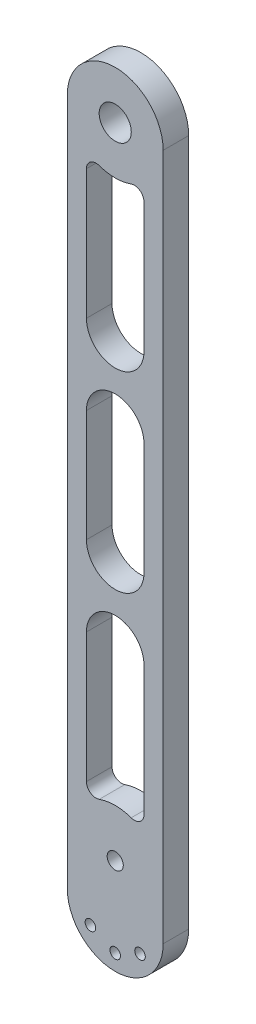
ISO-10303-21;
HEADER;
FILE_DESCRIPTION(('STEP AP214'),'2;1');
FILE_NAME('part.step','',(''),(''),'','','');
FILE_SCHEMA(('AUTOMOTIVE_DESIGN { 1 0 10303 214 1 1 1 1 }'));
ENDSEC;
DATA;
#1=APPLICATION_CONTEXT('core data for automotive mechanical design processes');
#2=APPLICATION_PROTOCOL_DEFINITION('international standard','automotive_design',2000,#1);
#3=PRODUCT_CONTEXT('',#1,'mechanical');
#4=PRODUCT('Part','Part','',(#3));
#5=PRODUCT_RELATED_PRODUCT_CATEGORY('part','',(#4));
#6=PRODUCT_DEFINITION_FORMATION('','',#4);
#7=PRODUCT_DEFINITION_CONTEXT('part definition',#1,'design');
#8=PRODUCT_DEFINITION('design','',#6,#7);
#9=PRODUCT_DEFINITION_SHAPE('','',#8);
#10=(LENGTH_UNIT() NAMED_UNIT(*) SI_UNIT(.MILLI.,.METRE.));
#11=(NAMED_UNIT(*) PLANE_ANGLE_UNIT() SI_UNIT($,.RADIAN.));
#12=(NAMED_UNIT(*) SI_UNIT($,.STERADIAN.) SOLID_ANGLE_UNIT());
#13=UNCERTAINTY_MEASURE_WITH_UNIT(LENGTH_MEASURE(1.E-05),#10,'distance_accuracy_value','');
#14=(GEOMETRIC_REPRESENTATION_CONTEXT(3) GLOBAL_UNCERTAINTY_ASSIGNED_CONTEXT((#13)) GLOBAL_UNIT_ASSIGNED_CONTEXT((#10,
#11,#12)) REPRESENTATION_CONTEXT('',''));
#15=CARTESIAN_POINT('',(0.,0.,0.));
#16=DIRECTION('',(0.,0.,1.));
#17=DIRECTION('',(1.,0.,0.));
#18=AXIS2_PLACEMENT_3D('',#15,#16,#17);
#19=CARTESIAN_POINT('',(0.,0.,8.));
#20=DIRECTION('',(0.,0.,1.));
#21=DIRECTION('',(1.,0.,0.));
#22=AXIS2_PLACEMENT_3D('',#19,#20,#21);
#23=PLANE('',#22);
#24=CARTESIAN_POINT('',(0.,0.,8.));
#25=DIRECTION('',(0.,0.,1.));
#26=DIRECTION('',(1.,0.,0.));
#27=AXIS2_PLACEMENT_3D('',#24,#25,#26);
#28=CIRCLE('',#27,5.025);
#29=CARTESIAN_POINT('',(5.025,0.,8.));
#30=VERTEX_POINT('',#29);
#31=EDGE_CURVE('E336',#30,#30,#28,.T.);
#32=ORIENTED_EDGE('',*,*,#31,.F.);
#33=EDGE_LOOP('',(#32));
#34=FACE_BOUND('',#33,.T.);
#35=CARTESIAN_POINT('',(0.,0.,8.));
#36=DIRECTION('',(0.,0.,1.));
#37=DIRECTION('',(1.,0.,0.));
#38=AXIS2_PLACEMENT_3D('',#35,#36,#37);
#39=CIRCLE('',#38,15.);
#40=CARTESIAN_POINT('',(15.,0.,8.));
#41=VERTEX_POINT('',#40);
#42=CARTESIAN_POINT('',(-15.,0.,8.));
#43=VERTEX_POINT('',#42);
#44=EDGE_CURVE('E189',#41,#43,#39,.T.);
#45=ORIENTED_EDGE('',*,*,#44,.T.);
#46=DIRECTION('',(0.,-1.,0.));
#47=VECTOR('',#46,1.);
#48=CARTESIAN_POINT('',(-15.,0.,8.));
#49=LINE('',#48,#47);
#50=CARTESIAN_POINT('',(-15.,-215.,8.));
#51=VERTEX_POINT('',#50);
#52=EDGE_CURVE('E182',#43,#51,#49,.T.);
#53=ORIENTED_EDGE('',*,*,#52,.T.);
#54=CARTESIAN_POINT('',(0.,-215.,8.));
#55=DIRECTION('',(0.,0.,1.));
#56=DIRECTION('',(1.,0.,0.));
#57=AXIS2_PLACEMENT_3D('',#54,#55,#56);
#58=CIRCLE('',#57,15.);
#59=CARTESIAN_POINT('',(15.,-215.,8.));
#60=VERTEX_POINT('',#59);
#61=EDGE_CURVE('E186',#51,#60,#58,.T.);
#62=ORIENTED_EDGE('',*,*,#61,.T.);
#63=DIRECTION('',(0.,1.,0.));
#64=VECTOR('',#63,1.);
#65=CARTESIAN_POINT('',(15.,0.,8.));
#66=LINE('',#65,#64);
#67=EDGE_CURVE('E192',#60,#41,#66,.T.);
#68=ORIENTED_EDGE('',*,*,#67,.T.);
#69=EDGE_LOOP('',(#45,#53,#62,#68));
#70=FACE_BOUND('',#69,.T.);
#71=CARTESIAN_POINT('',(0.,-200.,8.));
#72=DIRECTION('',(0.,0.,1.));
#73=DIRECTION('',(1.,0.,0.));
#74=AXIS2_PLACEMENT_3D('',#71,#72,#73);
#75=CIRCLE('',#74,2.525);
#76=CARTESIAN_POINT('',(2.525,-200.,8.));
#77=VERTEX_POINT('',#76);
#78=EDGE_CURVE('E330',#77,#77,#75,.T.);
#79=ORIENTED_EDGE('',*,*,#78,.F.);
#80=EDGE_LOOP('',(#79));
#81=FACE_BOUND('',#80,.T.);
#82=DIRECTION('',(0.,1.,0.));
#83=VECTOR('',#82,1.);
#84=CARTESIAN_POINT('',(9.,-16.9705627484771,8.));
#85=LINE('',#84,#83);
#86=CARTESIAN_POINT('',(9.,-57.5,8.));
#87=VERTEX_POINT('',#86);
#88=CARTESIAN_POINT('',(9.,-16.9705627484771,8.));
#89=VERTEX_POINT('',#88);
#90=EDGE_CURVE('E287',#87,#89,#85,.T.);
#91=ORIENTED_EDGE('',*,*,#90,.F.);
#92=CARTESIAN_POINT('',(0.,-57.5,8.));
#93=DIRECTION('',(0.,0.,1.));
#94=DIRECTION('',(1.,0.,0.));
#95=AXIS2_PLACEMENT_3D('',#92,#93,#94);
#96=CIRCLE('',#95,9.);
#97=CARTESIAN_POINT('',(-9.,-57.5,8.));
#98=VERTEX_POINT('',#97);
#99=EDGE_CURVE('E285',#98,#87,#96,.T.);
#100=ORIENTED_EDGE('',*,*,#99,.F.);
#101=DIRECTION('',(0.,-1.,0.));
#102=VECTOR('',#101,1.);
#103=CARTESIAN_POINT('',(-9.,-16.9705627484771,8.));
#104=LINE('',#103,#102);
#105=CARTESIAN_POINT('',(-9.,-16.9705627484771,8.));
#106=VERTEX_POINT('',#105);
#107=EDGE_CURVE('E297',#106,#98,#104,.T.);
#108=ORIENTED_EDGE('',*,*,#107,.F.);
#109=CARTESIAN_POINT('',(-6.,-16.9705627484771,8.));
#110=DIRECTION('',(0.,0.,1.));
#111=DIRECTION('',(1.,0.,0.));
#112=AXIS2_PLACEMENT_3D('',#109,#110,#111);
#113=CIRCLE('',#112,3.);
#114=CARTESIAN_POINT('',(-5.,-14.142135623731,8.));
#115=VERTEX_POINT('',#114);
#116=EDGE_CURVE('E294',#115,#106,#113,.T.);
#117=ORIENTED_EDGE('',*,*,#116,.F.);
#118=CARTESIAN_POINT('',(0.,0.,8.));
#119=DIRECTION('',(0.,0.,-1.));
#120=DIRECTION('',(1.,0.,0.));
#121=AXIS2_PLACEMENT_3D('',#118,#119,#120);
#122=CIRCLE('',#121,15.);
#123=CARTESIAN_POINT('',(5.,-14.142135623731,8.));
#124=VERTEX_POINT('',#123);
#125=EDGE_CURVE('E292',#124,#115,#122,.T.);
#126=ORIENTED_EDGE('',*,*,#125,.F.);
#127=CARTESIAN_POINT('',(6.,-16.9705627484771,8.));
#128=DIRECTION('',(0.,0.,1.));
#129=DIRECTION('',(1.,0.,0.));
#130=AXIS2_PLACEMENT_3D('',#127,#128,#129);
#131=CIRCLE('',#130,3.);
#132=EDGE_CURVE('E290',#89,#124,#131,.T.);
#133=ORIENTED_EDGE('',*,*,#132,.F.);
#134=EDGE_LOOP('',(#91,#100,#108,#117,#126,#133));
#135=FACE_BOUND('',#134,.T.);
#136=DIRECTION('',(0.,-1.,0.));
#137=VECTOR('',#136,1.);
#138=CARTESIAN_POINT('',(-8.99999999999999,-82.5,8.));
#139=LINE('',#138,#137);
#140=CARTESIAN_POINT('',(-8.99999999999999,-82.5,8.));
#141=VERTEX_POINT('',#140);
#142=CARTESIAN_POINT('',(-8.99999999999999,-117.5,8.));
#143=VERTEX_POINT('',#142);
#144=EDGE_CURVE('E256',#141,#143,#139,.T.);
#145=ORIENTED_EDGE('',*,*,#144,.F.);
#146=CARTESIAN_POINT('',(0.,-82.5,8.));
#147=DIRECTION('',(0.,0.,1.));
#148=DIRECTION('',(1.,0.,0.));
#149=AXIS2_PLACEMENT_3D('',#146,#147,#148);
#150=CIRCLE('',#149,9.);
#151=CARTESIAN_POINT('',(9.00000000000001,-82.5,8.));
#152=VERTEX_POINT('',#151);
#153=EDGE_CURVE('E254',#152,#141,#150,.T.);
#154=ORIENTED_EDGE('',*,*,#153,.F.);
#155=DIRECTION('',(0.,1.,0.));
#156=VECTOR('',#155,1.);
#157=CARTESIAN_POINT('',(9.00000000000001,-82.5,8.));
#158=LINE('',#157,#156);
#159=CARTESIAN_POINT('',(9.00000000000002,-117.5,8.));
#160=VERTEX_POINT('',#159);
#161=EDGE_CURVE('E262',#160,#152,#158,.T.);
#162=ORIENTED_EDGE('',*,*,#161,.F.);
#163=CARTESIAN_POINT('',(0.,-117.5,8.));
#164=DIRECTION('',(0.,0.,1.));
#165=DIRECTION('',(1.,0.,0.));
#166=AXIS2_PLACEMENT_3D('',#163,#164,#165);
#167=CIRCLE('',#166,9.);
#168=EDGE_CURVE('E259',#143,#160,#167,.T.);
#169=ORIENTED_EDGE('',*,*,#168,.F.);
#170=EDGE_LOOP('',(#145,#154,#162,#169));
#171=FACE_BOUND('',#170,.T.);
#172=CARTESIAN_POINT('',(6.,-183.029437251523,8.));
#173=DIRECTION('',(0.,0.,1.));
#174=DIRECTION('',(-1.,0.,0.));
#175=AXIS2_PLACEMENT_3D('',#172,#173,#174);
#176=CIRCLE('',#175,3.);
#177=CARTESIAN_POINT('',(5.,-185.857864376269,8.));
#178=VERTEX_POINT('',#177);
#179=CARTESIAN_POINT('',(9.,-183.029437251523,8.));
#180=VERTEX_POINT('',#179);
#181=EDGE_CURVE('E216',#178,#180,#176,.T.);
#182=ORIENTED_EDGE('',*,*,#181,.F.);
#183=CARTESIAN_POINT('',(0.,-200.,8.));
#184=DIRECTION('',(0.,0.,-1.));
#185=DIRECTION('',(-1.,0.,0.));
#186=AXIS2_PLACEMENT_3D('',#183,#184,#185);
#187=CIRCLE('',#186,15.);
#188=CARTESIAN_POINT('',(-4.99999999999999,-185.857864376269,8.));
#189=VERTEX_POINT('',#188);
#190=EDGE_CURVE('E214',#189,#178,#187,.T.);
#191=ORIENTED_EDGE('',*,*,#190,.F.);
#192=CARTESIAN_POINT('',(-6.,-183.029437251523,8.));
#193=DIRECTION('',(0.,0.,1.));
#194=DIRECTION('',(-1.,0.,0.));
#195=AXIS2_PLACEMENT_3D('',#192,#193,#194);
#196=CIRCLE('',#195,3.);
#197=CARTESIAN_POINT('',(-8.99999999999999,-183.029437251523,8.));
#198=VERTEX_POINT('',#197);
#199=EDGE_CURVE('E225',#198,#189,#196,.T.);
#200=ORIENTED_EDGE('',*,*,#199,.F.);
#201=DIRECTION('',(0.,-1.,0.));
#202=VECTOR('',#201,1.);
#203=CARTESIAN_POINT('',(-9.,-183.029437251523,8.));
#204=LINE('',#203,#202);
#205=CARTESIAN_POINT('',(-9.,-142.5,8.));
#206=VERTEX_POINT('',#205);
#207=EDGE_CURVE('E223',#206,#198,#204,.T.);
#208=ORIENTED_EDGE('',*,*,#207,.F.);
#209=CARTESIAN_POINT('',(0.,-142.5,8.));
#210=DIRECTION('',(0.,0.,1.));
#211=DIRECTION('',(-1.,0.,0.));
#212=AXIS2_PLACEMENT_3D('',#209,#210,#211);
#213=CIRCLE('',#212,9.);
#214=CARTESIAN_POINT('',(9.,-142.5,8.));
#215=VERTEX_POINT('',#214);
#216=EDGE_CURVE('E221',#215,#206,#213,.T.);
#217=ORIENTED_EDGE('',*,*,#216,.F.);
#218=DIRECTION('',(0.,1.,0.));
#219=VECTOR('',#218,1.);
#220=CARTESIAN_POINT('',(9.,-183.029437251523,8.));
#221=LINE('',#220,#219);
#222=EDGE_CURVE('E219',#180,#215,#221,.T.);
#223=ORIENTED_EDGE('',*,*,#222,.F.);
#224=EDGE_LOOP('',(#182,#191,#200,#208,#217,#223));
#225=FACE_BOUND('',#224,.T.);
#226=CARTESIAN_POINT('',(-7.75670725284747,-221.311378026519,8.));
#227=DIRECTION('',(0.,0.,1.));
#228=DIRECTION('',(1.,0.,0.));
#229=AXIS2_PLACEMENT_3D('',#226,#227,#228);
#230=CIRCLE('',#229,1.65);
#231=CARTESIAN_POINT('',(-6.10670725284746,-221.311378026519,8.));
#232=VERTEX_POINT('',#231);
#233=EDGE_CURVE('E469',#232,#232,#230,.T.);
#234=ORIENTED_EDGE('',*,*,#233,.F.);
#235=EDGE_LOOP('',(#234));
#236=FACE_BOUND('',#235,.T.);
#237=CARTESIAN_POINT('',(0.,-225.,8.));
#238=DIRECTION('',(0.,0.,1.));
#239=DIRECTION('',(1.,0.,0.));
#240=AXIS2_PLACEMENT_3D('',#237,#238,#239);
#241=CIRCLE('',#240,1.65);
#242=CARTESIAN_POINT('',(1.65000000000001,-225.,8.));
#243=VERTEX_POINT('',#242);
#244=EDGE_CURVE('E208',#243,#243,#241,.T.);
#245=ORIENTED_EDGE('',*,*,#244,.F.);
#246=EDGE_LOOP('',(#245));
#247=FACE_BOUND('',#246,.T.);
#248=CARTESIAN_POINT('',(7.75670725284747,-221.311378026519,8.));
#249=DIRECTION('',(0.,0.,1.));
#250=DIRECTION('',(1.,0.,0.));
#251=AXIS2_PLACEMENT_3D('',#248,#249,#250);
#252=CIRCLE('',#251,1.65);
#253=CARTESIAN_POINT('',(9.40670725284747,-221.311378026519,8.));
#254=VERTEX_POINT('',#253);
#255=EDGE_CURVE('E460',#254,#254,#252,.T.);
#256=ORIENTED_EDGE('',*,*,#255,.F.);
#257=EDGE_LOOP('',(#256));
#258=FACE_BOUND('',#257,.T.);
#259=ADVANCED_FACE('F43',(#34,#70,#81,#135,#171,#225,#236,#247,#258),#23,.T.);
#260=CARTESIAN_POINT('',(0.,0.,0.));
#261=DIRECTION('',(0.,0.,1.));
#262=DIRECTION('',(1.,0.,0.));
#263=AXIS2_PLACEMENT_3D('',#260,#261,#262);
#264=PLANE('',#263);
#265=CARTESIAN_POINT('',(0.,-82.5,0.));
#266=DIRECTION('',(0.,0.,1.));
#267=DIRECTION('',(1.,0.,0.));
#268=AXIS2_PLACEMENT_3D('',#265,#266,#267);
#269=CIRCLE('',#268,9.);
#270=CARTESIAN_POINT('',(9.00000000000001,-82.5,0.));
#271=VERTEX_POINT('',#270);
#272=CARTESIAN_POINT('',(-8.99999999999999,-82.5,0.));
#273=VERTEX_POINT('',#272);
#274=EDGE_CURVE('E253',#271,#273,#269,.T.);
#275=ORIENTED_EDGE('',*,*,#274,.T.);
#276=DIRECTION('',(0.,-1.,0.));
#277=VECTOR('',#276,1.);
#278=CARTESIAN_POINT('',(-8.99999999999999,-82.5,0.));
#279=LINE('',#278,#277);
#280=CARTESIAN_POINT('',(-8.99999999999999,-117.5,0.));
#281=VERTEX_POINT('',#280);
#282=EDGE_CURVE('E267',#273,#281,#279,.T.);
#283=ORIENTED_EDGE('',*,*,#282,.T.);
#284=CARTESIAN_POINT('',(0.,-117.5,0.));
#285=DIRECTION('',(0.,0.,1.));
#286=DIRECTION('',(1.,0.,0.));
#287=AXIS2_PLACEMENT_3D('',#284,#285,#286);
#288=CIRCLE('',#287,9.);
#289=CARTESIAN_POINT('',(9.00000000000002,-117.5,0.));
#290=VERTEX_POINT('',#289);
#291=EDGE_CURVE('E270',#281,#290,#288,.T.);
#292=ORIENTED_EDGE('',*,*,#291,.T.);
#293=DIRECTION('',(0.,1.,0.));
#294=VECTOR('',#293,1.);
#295=CARTESIAN_POINT('',(9.00000000000001,-82.5,0.));
#296=LINE('',#295,#294);
#297=EDGE_CURVE('E257',#290,#271,#296,.T.);
#298=ORIENTED_EDGE('',*,*,#297,.T.);
#299=EDGE_LOOP('',(#275,#283,#292,#298));
#300=FACE_BOUND('',#299,.T.);
#301=CARTESIAN_POINT('',(0.,-200.,0.));
#302=DIRECTION('',(0.,0.,1.));
#303=DIRECTION('',(1.,0.,0.));
#304=AXIS2_PLACEMENT_3D('',#301,#302,#303);
#305=CIRCLE('',#304,2.525);
#306=CARTESIAN_POINT('',(2.525,-200.,0.));
#307=VERTEX_POINT('',#306);
#308=EDGE_CURVE('E329',#307,#307,#305,.T.);
#309=ORIENTED_EDGE('',*,*,#308,.T.);
#310=EDGE_LOOP('',(#309));
#311=FACE_BOUND('',#310,.T.);
#312=CARTESIAN_POINT('',(0.,0.,0.));
#313=DIRECTION('',(0.,0.,1.));
#314=DIRECTION('',(1.,0.,0.));
#315=AXIS2_PLACEMENT_3D('',#312,#313,#314);
#316=CIRCLE('',#315,5.025);
#317=CARTESIAN_POINT('',(5.025,0.,0.));
#318=VERTEX_POINT('',#317);
#319=EDGE_CURVE('E333',#318,#318,#316,.T.);
#320=ORIENTED_EDGE('',*,*,#319,.T.);
#321=EDGE_LOOP('',(#320));
#322=FACE_BOUND('',#321,.T.);
#323=CARTESIAN_POINT('',(0.,0.,0.));
#324=DIRECTION('',(0.,0.,1.));
#325=DIRECTION('',(1.,0.,0.));
#326=AXIS2_PLACEMENT_3D('',#323,#324,#325);
#327=CIRCLE('',#326,15.);
#328=CARTESIAN_POINT('',(15.,0.,0.));
#329=VERTEX_POINT('',#328);
#330=CARTESIAN_POINT('',(-15.,0.,0.));
#331=VERTEX_POINT('',#330);
#332=EDGE_CURVE('E339',#329,#331,#327,.T.);
#333=ORIENTED_EDGE('',*,*,#332,.F.);
#334=DIRECTION('',(0.,1.,0.));
#335=VECTOR('',#334,1.);
#336=CARTESIAN_POINT('',(15.,0.,0.));
#337=LINE('',#336,#335);
#338=CARTESIAN_POINT('',(15.,-215.,0.));
#339=VERTEX_POINT('',#338);
#340=EDGE_CURVE('E342',#339,#329,#337,.T.);
#341=ORIENTED_EDGE('',*,*,#340,.F.);
#342=CARTESIAN_POINT('',(0.,-215.,0.));
#343=DIRECTION('',(0.,0.,1.));
#344=DIRECTION('',(1.,0.,0.));
#345=AXIS2_PLACEMENT_3D('',#342,#343,#344);
#346=CIRCLE('',#345,15.);
#347=CARTESIAN_POINT('',(-15.,-215.,0.));
#348=VERTEX_POINT('',#347);
#349=EDGE_CURVE('E205',#348,#339,#346,.T.);
#350=ORIENTED_EDGE('',*,*,#349,.F.);
#351=DIRECTION('',(0.,-1.,0.));
#352=VECTOR('',#351,1.);
#353=CARTESIAN_POINT('',(-15.,0.,0.));
#354=LINE('',#353,#352);
#355=EDGE_CURVE('E197',#331,#348,#354,.T.);
#356=ORIENTED_EDGE('',*,*,#355,.F.);
#357=EDGE_LOOP('',(#333,#341,#350,#356));
#358=FACE_BOUND('',#357,.T.);
#359=CARTESIAN_POINT('',(0.,-57.5,0.));
#360=DIRECTION('',(0.,0.,1.));
#361=DIRECTION('',(1.,0.,0.));
#362=AXIS2_PLACEMENT_3D('',#359,#360,#361);
#363=CIRCLE('',#362,9.);
#364=CARTESIAN_POINT('',(-9.,-57.5,0.));
#365=VERTEX_POINT('',#364);
#366=CARTESIAN_POINT('',(9.,-57.5,0.));
#367=VERTEX_POINT('',#366);
#368=EDGE_CURVE('E284',#365,#367,#363,.T.);
#369=ORIENTED_EDGE('',*,*,#368,.T.);
#370=DIRECTION('',(0.,1.,0.));
#371=VECTOR('',#370,1.);
#372=CARTESIAN_POINT('',(9.,-16.9705627484771,0.));
#373=LINE('',#372,#371);
#374=CARTESIAN_POINT('',(9.,-16.9705627484771,0.));
#375=VERTEX_POINT('',#374);
#376=EDGE_CURVE('E302',#367,#375,#373,.T.);
#377=ORIENTED_EDGE('',*,*,#376,.T.);
#378=CARTESIAN_POINT('',(6.,-16.9705627484771,0.));
#379=DIRECTION('',(0.,0.,1.));
#380=DIRECTION('',(1.,0.,0.));
#381=AXIS2_PLACEMENT_3D('',#378,#379,#380);
#382=CIRCLE('',#381,3.);
#383=CARTESIAN_POINT('',(5.,-14.142135623731,0.));
#384=VERTEX_POINT('',#383);
#385=EDGE_CURVE('E305',#375,#384,#382,.T.);
#386=ORIENTED_EDGE('',*,*,#385,.T.);
#387=CARTESIAN_POINT('',(0.,0.,0.));
#388=DIRECTION('',(0.,0.,-1.));
#389=DIRECTION('',(1.,0.,0.));
#390=AXIS2_PLACEMENT_3D('',#387,#388,#389);
#391=CIRCLE('',#390,15.);
#392=CARTESIAN_POINT('',(-5.,-14.142135623731,0.));
#393=VERTEX_POINT('',#392);
#394=EDGE_CURVE('E308',#384,#393,#391,.T.);
#395=ORIENTED_EDGE('',*,*,#394,.T.);
#396=CARTESIAN_POINT('',(-6.,-16.9705627484771,0.));
#397=DIRECTION('',(0.,0.,1.));
#398=DIRECTION('',(1.,0.,0.));
#399=AXIS2_PLACEMENT_3D('',#396,#397,#398);
#400=CIRCLE('',#399,3.);
#401=CARTESIAN_POINT('',(-9.,-16.9705627484771,0.));
#402=VERTEX_POINT('',#401);
#403=EDGE_CURVE('E311',#393,#402,#400,.T.);
#404=ORIENTED_EDGE('',*,*,#403,.T.);
#405=DIRECTION('',(0.,-1.,0.));
#406=VECTOR('',#405,1.);
#407=CARTESIAN_POINT('',(-9.,-16.9705627484771,0.));
#408=LINE('',#407,#406);
#409=EDGE_CURVE('E288',#402,#365,#408,.T.);
#410=ORIENTED_EDGE('',*,*,#409,.T.);
#411=EDGE_LOOP('',(#369,#377,#386,#395,#404,#410));
#412=FACE_BOUND('',#411,.T.);
#413=CARTESIAN_POINT('',(0.,-200.,0.));
#414=DIRECTION('',(0.,0.,-1.));
#415=DIRECTION('',(-1.,0.,0.));
#416=AXIS2_PLACEMENT_3D('',#413,#414,#415);
#417=CIRCLE('',#416,15.);
#418=CARTESIAN_POINT('',(-4.99999999999999,-185.857864376269,0.));
#419=VERTEX_POINT('',#418);
#420=CARTESIAN_POINT('',(5.,-185.857864376269,0.));
#421=VERTEX_POINT('',#420);
#422=EDGE_CURVE('E66',#419,#421,#417,.T.);
#423=ORIENTED_EDGE('',*,*,#422,.T.);
#424=CARTESIAN_POINT('',(6.,-183.029437251523,0.));
#425=DIRECTION('',(0.,0.,1.));
#426=DIRECTION('',(-1.,0.,0.));
#427=AXIS2_PLACEMENT_3D('',#424,#425,#426);
#428=CIRCLE('',#427,3.);
#429=CARTESIAN_POINT('',(9.,-183.029437251523,0.));
#430=VERTEX_POINT('',#429);
#431=EDGE_CURVE('E229',#421,#430,#428,.T.);
#432=ORIENTED_EDGE('',*,*,#431,.T.);
#433=DIRECTION('',(0.,1.,0.));
#434=VECTOR('',#433,1.);
#435=CARTESIAN_POINT('',(9.,-183.029437251523,0.));
#436=LINE('',#435,#434);
#437=CARTESIAN_POINT('',(9.,-142.5,0.));
#438=VERTEX_POINT('',#437);
#439=EDGE_CURVE('E232',#430,#438,#436,.T.);
#440=ORIENTED_EDGE('',*,*,#439,.T.);
#441=CARTESIAN_POINT('',(0.,-142.5,0.));
#442=DIRECTION('',(0.,0.,1.));
#443=DIRECTION('',(-1.,0.,0.));
#444=AXIS2_PLACEMENT_3D('',#441,#442,#443);
#445=CIRCLE('',#444,9.);
#446=CARTESIAN_POINT('',(-9.,-142.5,0.));
#447=VERTEX_POINT('',#446);
#448=EDGE_CURVE('E235',#438,#447,#445,.T.);
#449=ORIENTED_EDGE('',*,*,#448,.T.);
#450=DIRECTION('',(0.,-1.,0.));
#451=VECTOR('',#450,1.);
#452=CARTESIAN_POINT('',(-9.,-183.029437251523,0.));
#453=LINE('',#452,#451);
#454=CARTESIAN_POINT('',(-8.99999999999999,-183.029437251523,0.));
#455=VERTEX_POINT('',#454);
#456=EDGE_CURVE('E238',#447,#455,#453,.T.);
#457=ORIENTED_EDGE('',*,*,#456,.T.);
#458=CARTESIAN_POINT('',(-6.,-183.029437251523,0.));
#459=DIRECTION('',(0.,0.,1.));
#460=DIRECTION('',(-1.,0.,0.));
#461=AXIS2_PLACEMENT_3D('',#458,#459,#460);
#462=CIRCLE('',#461,3.);
#463=EDGE_CURVE('E217',#455,#419,#462,.T.);
#464=ORIENTED_EDGE('',*,*,#463,.T.);
#465=EDGE_LOOP('',(#423,#432,#440,#449,#457,#464));
#466=FACE_BOUND('',#465,.T.);
#467=CARTESIAN_POINT('',(0.,-225.,0.));
#468=DIRECTION('',(0.,0.,1.));
#469=DIRECTION('',(1.,0.,0.));
#470=AXIS2_PLACEMENT_3D('',#467,#468,#469);
#471=CIRCLE('',#470,1.65);
#472=CARTESIAN_POINT('',(1.65000000000001,-225.,0.));
#473=VERTEX_POINT('',#472);
#474=EDGE_CURVE('E211',#473,#473,#471,.T.);
#475=ORIENTED_EDGE('',*,*,#474,.T.);
#476=EDGE_LOOP('',(#475));
#477=FACE_BOUND('',#476,.T.);
#478=CARTESIAN_POINT('',(-7.75670725284747,-221.311378026519,0.));
#479=DIRECTION('',(0.,0.,1.));
#480=DIRECTION('',(1.,0.,0.));
#481=AXIS2_PLACEMENT_3D('',#478,#479,#480);
#482=CIRCLE('',#481,1.65);
#483=CARTESIAN_POINT('',(-6.10670725284746,-221.311378026519,0.));
#484=VERTEX_POINT('',#483);
#485=EDGE_CURVE('E466',#484,#484,#482,.T.);
#486=ORIENTED_EDGE('',*,*,#485,.T.);
#487=EDGE_LOOP('',(#486));
#488=FACE_BOUND('',#487,.T.);
#489=CARTESIAN_POINT('',(7.75670725284747,-221.311378026519,0.));
#490=DIRECTION('',(0.,0.,1.));
#491=DIRECTION('',(1.,0.,0.));
#492=AXIS2_PLACEMENT_3D('',#489,#490,#491);
#493=CIRCLE('',#492,1.65);
#494=CARTESIAN_POINT('',(9.40670725284747,-221.311378026519,0.));
#495=VERTEX_POINT('',#494);
#496=EDGE_CURVE('E463',#495,#495,#493,.T.);
#497=ORIENTED_EDGE('',*,*,#496,.T.);
#498=EDGE_LOOP('',(#497));
#499=FACE_BOUND('',#498,.T.);
#500=ADVANCED_FACE('F354',(#300,#311,#322,#358,#412,#466,#477,#488,#499),#264,.F.);
#501=CARTESIAN_POINT('',(0.,0.,8.));
#502=DIRECTION('',(0.,0.,-1.));
#503=DIRECTION('',(-1.,0.,0.));
#504=AXIS2_PLACEMENT_3D('',#501,#502,#503);
#505=CYLINDRICAL_SURFACE('',#504,15.);
#506=ORIENTED_EDGE('',*,*,#332,.T.);
#507=DIRECTION('',(0.,0.,-1.));
#508=VECTOR('',#507,1.);
#509=CARTESIAN_POINT('',(-15.,0.,8.));
#510=LINE('',#509,#508);
#511=EDGE_CURVE('E11',#43,#331,#510,.T.);
#512=ORIENTED_EDGE('',*,*,#511,.F.);
#513=ORIENTED_EDGE('',*,*,#44,.F.);
#514=DIRECTION('',(0.,0.,-1.));
#515=VECTOR('',#514,1.);
#516=CARTESIAN_POINT('',(15.,0.,8.));
#517=LINE('',#516,#515);
#518=EDGE_CURVE('E51',#41,#329,#517,.T.);
#519=ORIENTED_EDGE('',*,*,#518,.T.);
#520=EDGE_LOOP('',(#506,#512,#513,#519));
#521=FACE_BOUND('',#520,.T.);
#522=ADVANCED_FACE('F45',(#521),#505,.T.);
#523=CARTESIAN_POINT('',(-15.,0.,8.));
#524=DIRECTION('',(1.,0.,0.));
#525=DIRECTION('',(0.,1.,0.));
#526=AXIS2_PLACEMENT_3D('',#523,#524,#525);
#527=PLANE('',#526);
#528=ORIENTED_EDGE('',*,*,#355,.T.);
#529=DIRECTION('',(0.,0.,-1.));
#530=VECTOR('',#529,1.);
#531=CARTESIAN_POINT('',(-15.,-215.,8.));
#532=LINE('',#531,#530);
#533=EDGE_CURVE('E195',#51,#348,#532,.T.);
#534=ORIENTED_EDGE('',*,*,#533,.F.);
#535=ORIENTED_EDGE('',*,*,#52,.F.);
#536=ORIENTED_EDGE('',*,*,#511,.T.);
#537=EDGE_LOOP('',(#528,#534,#535,#536));
#538=FACE_BOUND('',#537,.T.);
#539=ADVANCED_FACE('F196',(#538),#527,.F.);
#540=CARTESIAN_POINT('',(15.,0.,8.));
#541=DIRECTION('',(-1.,0.,0.));
#542=DIRECTION('',(0.,-1.,0.));
#543=AXIS2_PLACEMENT_3D('',#540,#541,#542);
#544=PLANE('',#543);
#545=ORIENTED_EDGE('',*,*,#340,.T.);
#546=ORIENTED_EDGE('',*,*,#518,.F.);
#547=ORIENTED_EDGE('',*,*,#67,.F.);
#548=DIRECTION('',(0.,0.,-1.));
#549=VECTOR('',#548,1.);
#550=CARTESIAN_POINT('',(15.,-215.,8.));
#551=LINE('',#550,#549);
#552=EDGE_CURVE('E201',#60,#339,#551,.T.);
#553=ORIENTED_EDGE('',*,*,#552,.T.);
#554=EDGE_LOOP('',(#545,#546,#547,#553));
#555=FACE_BOUND('',#554,.T.);
#556=ADVANCED_FACE('F356',(#555),#544,.F.);
#557=CARTESIAN_POINT('',(0.,0.,8.));
#558=DIRECTION('',(0.,0.,-1.));
#559=DIRECTION('',(-1.,0.,0.));
#560=AXIS2_PLACEMENT_3D('',#557,#558,#559);
#561=CYLINDRICAL_SURFACE('',#560,5.025);
#562=ORIENTED_EDGE('',*,*,#31,.T.);
#563=EDGE_LOOP('',(#562));
#564=FACE_BOUND('',#563,.T.);
#565=ORIENTED_EDGE('',*,*,#319,.F.);
#566=EDGE_LOOP('',(#565));
#567=FACE_BOUND('',#566,.T.);
#568=ADVANCED_FACE('F358',(#564,#567),#561,.F.);
#569=CARTESIAN_POINT('',(0.,-200.,8.));
#570=DIRECTION('',(0.,0.,-1.));
#571=DIRECTION('',(-1.,0.,0.));
#572=AXIS2_PLACEMENT_3D('',#569,#570,#571);
#573=CYLINDRICAL_SURFACE('',#572,2.525);
#574=ORIENTED_EDGE('',*,*,#78,.T.);
#575=EDGE_LOOP('',(#574));
#576=FACE_BOUND('',#575,.T.);
#577=ORIENTED_EDGE('',*,*,#308,.F.);
#578=EDGE_LOOP('',(#577));
#579=FACE_BOUND('',#578,.T.);
#580=ADVANCED_FACE('F365',(#576,#579),#573,.F.);
#581=CARTESIAN_POINT('',(0.,-57.5,8.));
#582=DIRECTION('',(0.,0.,-1.));
#583=DIRECTION('',(-1.,0.,0.));
#584=AXIS2_PLACEMENT_3D('',#581,#582,#583);
#585=CYLINDRICAL_SURFACE('',#584,9.);
#586=ORIENTED_EDGE('',*,*,#368,.F.);
#587=DIRECTION('',(0.,0.,-1.));
#588=VECTOR('',#587,1.);
#589=CARTESIAN_POINT('',(-9.,-57.5,8.));
#590=LINE('',#589,#588);
#591=EDGE_CURVE('E299',#98,#365,#590,.T.);
#592=ORIENTED_EDGE('',*,*,#591,.F.);
#593=ORIENTED_EDGE('',*,*,#99,.T.);
#594=DIRECTION('',(0.,0.,-1.));
#595=VECTOR('',#594,1.);
#596=CARTESIAN_POINT('',(9.,-57.5,8.));
#597=LINE('',#596,#595);
#598=EDGE_CURVE('E326',#87,#367,#597,.T.);
#599=ORIENTED_EDGE('',*,*,#598,.T.);
#600=EDGE_LOOP('',(#586,#592,#593,#599));
#601=FACE_BOUND('',#600,.T.);
#602=ADVANCED_FACE('F381',(#601),#585,.F.);
#603=CARTESIAN_POINT('',(9.,-16.9705627484771,8.));
#604=DIRECTION('',(-1.,0.,0.));
#605=DIRECTION('',(0.,-1.,0.));
#606=AXIS2_PLACEMENT_3D('',#603,#604,#605);
#607=PLANE('',#606);
#608=ORIENTED_EDGE('',*,*,#376,.F.);
#609=ORIENTED_EDGE('',*,*,#598,.F.);
#610=ORIENTED_EDGE('',*,*,#90,.T.);
#611=DIRECTION('',(0.,0.,-1.));
#612=VECTOR('',#611,1.);
#613=CARTESIAN_POINT('',(9.,-16.9705627484771,8.));
#614=LINE('',#613,#612);
#615=EDGE_CURVE('E324',#89,#375,#614,.T.);
#616=ORIENTED_EDGE('',*,*,#615,.T.);
#617=EDGE_LOOP('',(#608,#609,#610,#616));
#618=FACE_BOUND('',#617,.T.);
#619=ADVANCED_FACE('F385',(#618),#607,.T.);
#620=CARTESIAN_POINT('',(6.,-16.9705627484771,8.));
#621=DIRECTION('',(0.,0.,-1.));
#622=DIRECTION('',(-1.,0.,0.));
#623=AXIS2_PLACEMENT_3D('',#620,#621,#622);
#624=CYLINDRICAL_SURFACE('',#623,3.);
#625=ORIENTED_EDGE('',*,*,#385,.F.);
#626=ORIENTED_EDGE('',*,*,#615,.F.);
#627=ORIENTED_EDGE('',*,*,#132,.T.);
#628=DIRECTION('',(0.,0.,-1.));
#629=VECTOR('',#628,1.);
#630=CARTESIAN_POINT('',(5.,-14.142135623731,8.));
#631=LINE('',#630,#629);
#632=EDGE_CURVE('E322',#124,#384,#631,.T.);
#633=ORIENTED_EDGE('',*,*,#632,.T.);
#634=EDGE_LOOP('',(#625,#626,#627,#633));
#635=FACE_BOUND('',#634,.T.);
#636=ADVANCED_FACE('F389',(#635),#624,.F.);
#637=CARTESIAN_POINT('',(0.,0.,8.));
#638=DIRECTION('',(0.,0.,-1.));
#639=DIRECTION('',(-1.,0.,0.));
#640=AXIS2_PLACEMENT_3D('',#637,#638,#639);
#641=CYLINDRICAL_SURFACE('',#640,15.);
#642=ORIENTED_EDGE('',*,*,#394,.F.);
#643=ORIENTED_EDGE('',*,*,#632,.F.);
#644=ORIENTED_EDGE('',*,*,#125,.T.);
#645=DIRECTION('',(0.,0.,-1.));
#646=VECTOR('',#645,1.);
#647=CARTESIAN_POINT('',(-5.,-14.142135623731,8.));
#648=LINE('',#647,#646);
#649=EDGE_CURVE('E320',#115,#393,#648,.T.);
#650=ORIENTED_EDGE('',*,*,#649,.T.);
#651=EDGE_LOOP('',(#642,#643,#644,#650));
#652=FACE_BOUND('',#651,.T.);
#653=ADVANCED_FACE('F393',(#652),#641,.T.);
#654=CARTESIAN_POINT('',(-6.,-16.9705627484771,8.));
#655=DIRECTION('',(0.,0.,-1.));
#656=DIRECTION('',(-1.,0.,0.));
#657=AXIS2_PLACEMENT_3D('',#654,#655,#656);
#658=CYLINDRICAL_SURFACE('',#657,3.);
#659=ORIENTED_EDGE('',*,*,#403,.F.);
#660=ORIENTED_EDGE('',*,*,#649,.F.);
#661=ORIENTED_EDGE('',*,*,#116,.T.);
#662=DIRECTION('',(0.,0.,-1.));
#663=VECTOR('',#662,1.);
#664=CARTESIAN_POINT('',(-9.,-16.9705627484771,8.));
#665=LINE('',#664,#663);
#666=EDGE_CURVE('E318',#106,#402,#665,.T.);
#667=ORIENTED_EDGE('',*,*,#666,.T.);
#668=EDGE_LOOP('',(#659,#660,#661,#667));
#669=FACE_BOUND('',#668,.T.);
#670=ADVANCED_FACE('F397',(#669),#658,.F.);
#671=CARTESIAN_POINT('',(-9.,-16.9705627484771,8.));
#672=DIRECTION('',(1.,0.,0.));
#673=DIRECTION('',(0.,1.,0.));
#674=AXIS2_PLACEMENT_3D('',#671,#672,#673);
#675=PLANE('',#674);
#676=ORIENTED_EDGE('',*,*,#409,.F.);
#677=ORIENTED_EDGE('',*,*,#666,.F.);
#678=ORIENTED_EDGE('',*,*,#107,.T.);
#679=ORIENTED_EDGE('',*,*,#591,.T.);
#680=EDGE_LOOP('',(#676,#677,#678,#679));
#681=FACE_BOUND('',#680,.T.);
#682=ADVANCED_FACE('F401',(#681),#675,.T.);
#683=CARTESIAN_POINT('',(0.,-82.5,8.));
#684=DIRECTION('',(0.,0.,-1.));
#685=DIRECTION('',(-1.,0.,0.));
#686=AXIS2_PLACEMENT_3D('',#683,#684,#685);
#687=CYLINDRICAL_SURFACE('',#686,9.);
#688=ORIENTED_EDGE('',*,*,#274,.F.);
#689=DIRECTION('',(0.,0.,-1.));
#690=VECTOR('',#689,1.);
#691=CARTESIAN_POINT('',(9.00000000000001,-82.5,8.));
#692=LINE('',#691,#690);
#693=EDGE_CURVE('E264',#152,#271,#692,.T.);
#694=ORIENTED_EDGE('',*,*,#693,.F.);
#695=ORIENTED_EDGE('',*,*,#153,.T.);
#696=DIRECTION('',(0.,0.,-1.));
#697=VECTOR('',#696,1.);
#698=CARTESIAN_POINT('',(-8.99999999999999,-82.5,8.));
#699=LINE('',#698,#697);
#700=EDGE_CURVE('E281',#141,#273,#699,.T.);
#701=ORIENTED_EDGE('',*,*,#700,.T.);
#702=EDGE_LOOP('',(#688,#694,#695,#701));
#703=FACE_BOUND('',#702,.T.);
#704=ADVANCED_FACE('F405',(#703),#687,.F.);
#705=CARTESIAN_POINT('',(-8.99999999999999,-82.5,8.));
#706=DIRECTION('',(1.,0.,0.));
#707=DIRECTION('',(0.,1.,0.));
#708=AXIS2_PLACEMENT_3D('',#705,#706,#707);
#709=PLANE('',#708);
#710=ORIENTED_EDGE('',*,*,#282,.F.);
#711=ORIENTED_EDGE('',*,*,#700,.F.);
#712=ORIENTED_EDGE('',*,*,#144,.T.);
#713=DIRECTION('',(0.,0.,-1.));
#714=VECTOR('',#713,1.);
#715=CARTESIAN_POINT('',(-8.99999999999999,-117.5,8.));
#716=LINE('',#715,#714);
#717=EDGE_CURVE('E279',#143,#281,#716,.T.);
#718=ORIENTED_EDGE('',*,*,#717,.T.);
#719=EDGE_LOOP('',(#710,#711,#712,#718));
#720=FACE_BOUND('',#719,.T.);
#721=ADVANCED_FACE('F409',(#720),#709,.T.);
#722=CARTESIAN_POINT('',(0.,-117.5,8.));
#723=DIRECTION('',(0.,0.,-1.));
#724=DIRECTION('',(-1.,0.,0.));
#725=AXIS2_PLACEMENT_3D('',#722,#723,#724);
#726=CYLINDRICAL_SURFACE('',#725,9.);
#727=ORIENTED_EDGE('',*,*,#291,.F.);
#728=ORIENTED_EDGE('',*,*,#717,.F.);
#729=ORIENTED_EDGE('',*,*,#168,.T.);
#730=DIRECTION('',(0.,0.,-1.));
#731=VECTOR('',#730,1.);
#732=CARTESIAN_POINT('',(9.00000000000002,-117.5,8.));
#733=LINE('',#732,#731);
#734=EDGE_CURVE('E277',#160,#290,#733,.T.);
#735=ORIENTED_EDGE('',*,*,#734,.T.);
#736=EDGE_LOOP('',(#727,#728,#729,#735));
#737=FACE_BOUND('',#736,.T.);
#738=ADVANCED_FACE('F413',(#737),#726,.F.);
#739=CARTESIAN_POINT('',(9.00000000000001,-82.5,8.));
#740=DIRECTION('',(-1.,0.,0.));
#741=DIRECTION('',(0.,-1.,0.));
#742=AXIS2_PLACEMENT_3D('',#739,#740,#741);
#743=PLANE('',#742);
#744=ORIENTED_EDGE('',*,*,#297,.F.);
#745=ORIENTED_EDGE('',*,*,#734,.F.);
#746=ORIENTED_EDGE('',*,*,#161,.T.);
#747=ORIENTED_EDGE('',*,*,#693,.T.);
#748=EDGE_LOOP('',(#744,#745,#746,#747));
#749=FACE_BOUND('',#748,.T.);
#750=ADVANCED_FACE('F417',(#749),#743,.T.);
#751=CARTESIAN_POINT('',(0.,-200.,8.));
#752=DIRECTION('',(0.,0.,-1.));
#753=DIRECTION('',(-1.,0.,0.));
#754=AXIS2_PLACEMENT_3D('',#751,#752,#753);
#755=CYLINDRICAL_SURFACE('',#754,15.);
#756=ORIENTED_EDGE('',*,*,#422,.F.);
#757=DIRECTION('',(0.,0.,-1.));
#758=VECTOR('',#757,1.);
#759=CARTESIAN_POINT('',(-4.99999999999999,-185.857864376269,8.));
#760=LINE('',#759,#758);
#761=EDGE_CURVE('E227',#189,#419,#760,.T.);
#762=ORIENTED_EDGE('',*,*,#761,.F.);
#763=ORIENTED_EDGE('',*,*,#190,.T.);
#764=DIRECTION('',(0.,0.,-1.));
#765=VECTOR('',#764,1.);
#766=CARTESIAN_POINT('',(5.,-185.857864376269,8.));
#767=LINE('',#766,#765);
#768=EDGE_CURVE('E251',#178,#421,#767,.T.);
#769=ORIENTED_EDGE('',*,*,#768,.T.);
#770=EDGE_LOOP('',(#756,#762,#763,#769));
#771=FACE_BOUND('',#770,.T.);
#772=ADVANCED_FACE('F421',(#771),#755,.T.);
#773=CARTESIAN_POINT('',(6.,-183.029437251523,8.));
#774=DIRECTION('',(0.,0.,-1.));
#775=DIRECTION('',(-1.,0.,0.));
#776=AXIS2_PLACEMENT_3D('',#773,#774,#775);
#777=CYLINDRICAL_SURFACE('',#776,3.);
#778=ORIENTED_EDGE('',*,*,#431,.F.);
#779=ORIENTED_EDGE('',*,*,#768,.F.);
#780=ORIENTED_EDGE('',*,*,#181,.T.);
#781=DIRECTION('',(0.,0.,-1.));
#782=VECTOR('',#781,1.);
#783=CARTESIAN_POINT('',(9.,-183.029437251523,8.));
#784=LINE('',#783,#782);
#785=EDGE_CURVE('E249',#180,#430,#784,.T.);
#786=ORIENTED_EDGE('',*,*,#785,.T.);
#787=EDGE_LOOP('',(#778,#779,#780,#786));
#788=FACE_BOUND('',#787,.T.);
#789=ADVANCED_FACE('F425',(#788),#777,.F.);
#790=CARTESIAN_POINT('',(9.,-183.029437251523,8.));
#791=DIRECTION('',(-1.,0.,0.));
#792=DIRECTION('',(0.,-1.,0.));
#793=AXIS2_PLACEMENT_3D('',#790,#791,#792);
#794=PLANE('',#793);
#795=ORIENTED_EDGE('',*,*,#439,.F.);
#796=ORIENTED_EDGE('',*,*,#785,.F.);
#797=ORIENTED_EDGE('',*,*,#222,.T.);
#798=DIRECTION('',(0.,0.,-1.));
#799=VECTOR('',#798,1.);
#800=CARTESIAN_POINT('',(9.,-142.5,8.));
#801=LINE('',#800,#799);
#802=EDGE_CURVE('E247',#215,#438,#801,.T.);
#803=ORIENTED_EDGE('',*,*,#802,.T.);
#804=EDGE_LOOP('',(#795,#796,#797,#803));
#805=FACE_BOUND('',#804,.T.);
#806=ADVANCED_FACE('F428',(#805),#794,.T.);
#807=CARTESIAN_POINT('',(0.,-142.5,8.));
#808=DIRECTION('',(0.,0.,-1.));
#809=DIRECTION('',(-1.,0.,0.));
#810=AXIS2_PLACEMENT_3D('',#807,#808,#809);
#811=CYLINDRICAL_SURFACE('',#810,9.);
#812=ORIENTED_EDGE('',*,*,#448,.F.);
#813=ORIENTED_EDGE('',*,*,#802,.F.);
#814=ORIENTED_EDGE('',*,*,#216,.T.);
#815=DIRECTION('',(0.,0.,-1.));
#816=VECTOR('',#815,1.);
#817=CARTESIAN_POINT('',(-9.,-142.5,8.));
#818=LINE('',#817,#816);
#819=EDGE_CURVE('E245',#206,#447,#818,.T.);
#820=ORIENTED_EDGE('',*,*,#819,.T.);
#821=EDGE_LOOP('',(#812,#813,#814,#820));
#822=FACE_BOUND('',#821,.T.);
#823=ADVANCED_FACE('F432',(#822),#811,.F.);
#824=CARTESIAN_POINT('',(-9.,-183.029437251523,8.));
#825=DIRECTION('',(1.,0.,0.));
#826=DIRECTION('',(0.,1.,0.));
#827=AXIS2_PLACEMENT_3D('',#824,#825,#826);
#828=PLANE('',#827);
#829=ORIENTED_EDGE('',*,*,#456,.F.);
#830=ORIENTED_EDGE('',*,*,#819,.F.);
#831=ORIENTED_EDGE('',*,*,#207,.T.);
#832=DIRECTION('',(0.,0.,-1.));
#833=VECTOR('',#832,1.);
#834=CARTESIAN_POINT('',(-8.99999999999999,-183.029437251523,8.));
#835=LINE('',#834,#833);
#836=EDGE_CURVE('E58',#198,#455,#835,.T.);
#837=ORIENTED_EDGE('',*,*,#836,.T.);
#838=EDGE_LOOP('',(#829,#830,#831,#837));
#839=FACE_BOUND('',#838,.T.);
#840=ADVANCED_FACE('F436',(#839),#828,.T.);
#841=CARTESIAN_POINT('',(-6.,-183.029437251523,8.));
#842=DIRECTION('',(0.,0.,-1.));
#843=DIRECTION('',(-1.,0.,0.));
#844=AXIS2_PLACEMENT_3D('',#841,#842,#843);
#845=CYLINDRICAL_SURFACE('',#844,3.);
#846=ORIENTED_EDGE('',*,*,#463,.F.);
#847=ORIENTED_EDGE('',*,*,#836,.F.);
#848=ORIENTED_EDGE('',*,*,#199,.T.);
#849=ORIENTED_EDGE('',*,*,#761,.T.);
#850=EDGE_LOOP('',(#846,#847,#848,#849));
#851=FACE_BOUND('',#850,.T.);
#852=ADVANCED_FACE('F440',(#851),#845,.F.);
#853=CARTESIAN_POINT('',(0.,-215.,8.));
#854=DIRECTION('',(0.,0.,-1.));
#855=DIRECTION('',(-1.,0.,0.));
#856=AXIS2_PLACEMENT_3D('',#853,#854,#855);
#857=CYLINDRICAL_SURFACE('',#856,15.);
#858=ORIENTED_EDGE('',*,*,#349,.T.);
#859=ORIENTED_EDGE('',*,*,#552,.F.);
#860=ORIENTED_EDGE('',*,*,#61,.F.);
#861=ORIENTED_EDGE('',*,*,#533,.T.);
#862=EDGE_LOOP('',(#858,#859,#860,#861));
#863=FACE_BOUND('',#862,.T.);
#864=ADVANCED_FACE('F203',(#863),#857,.T.);
#865=CARTESIAN_POINT('',(0.,-225.,8.));
#866=DIRECTION('',(0.,0.,-1.));
#867=DIRECTION('',(-1.,0.,0.));
#868=AXIS2_PLACEMENT_3D('',#865,#866,#867);
#869=CYLINDRICAL_SURFACE('',#868,1.65);
#870=ORIENTED_EDGE('',*,*,#244,.T.);
#871=EDGE_LOOP('',(#870));
#872=FACE_BOUND('',#871,.T.);
#873=ORIENTED_EDGE('',*,*,#474,.F.);
#874=EDGE_LOOP('',(#873));
#875=FACE_BOUND('',#874,.T.);
#876=ADVANCED_FACE('F444',(#872,#875),#869,.F.);
#877=CARTESIAN_POINT('',(-7.75670725284747,-221.311378026519,8.));
#878=DIRECTION('',(0.,0.,-1.));
#879=DIRECTION('',(-1.,0.,0.));
#880=AXIS2_PLACEMENT_3D('',#877,#878,#879);
#881=CYLINDRICAL_SURFACE('',#880,1.65);
#882=ORIENTED_EDGE('',*,*,#233,.T.);
#883=EDGE_LOOP('',(#882));
#884=FACE_BOUND('',#883,.T.);
#885=ORIENTED_EDGE('',*,*,#485,.F.);
#886=EDGE_LOOP('',(#885));
#887=FACE_BOUND('',#886,.T.);
#888=ADVANCED_FACE('F447',(#884,#887),#881,.F.);
#889=CARTESIAN_POINT('',(7.75670725284747,-221.311378026519,8.));
#890=DIRECTION('',(0.,0.,-1.));
#891=DIRECTION('',(-1.,0.,0.));
#892=AXIS2_PLACEMENT_3D('',#889,#890,#891);
#893=CYLINDRICAL_SURFACE('',#892,1.65);
#894=ORIENTED_EDGE('',*,*,#255,.T.);
#895=EDGE_LOOP('',(#894));
#896=FACE_BOUND('',#895,.T.);
#897=ORIENTED_EDGE('',*,*,#496,.F.);
#898=EDGE_LOOP('',(#897));
#899=FACE_BOUND('',#898,.T.);
#900=ADVANCED_FACE('F451',(#896,#899),#893,.F.);
#901=CLOSED_SHELL('',(#259,#500,#522,#539,#556,#568,#580,#602,#619,#636,#653,#670,#682,#704,
#721,#738,#750,#772,#789,#806,#823,#840,#852,#864,#876,#888,#900));
#902=MANIFOLD_SOLID_BREP('B2',#901);
#903=ADVANCED_BREP_SHAPE_REPRESENTATION('',(#18,#902),#14);
#904=SHAPE_DEFINITION_REPRESENTATION(#9,#903);
ENDSEC;
END-ISO-10303-21;
